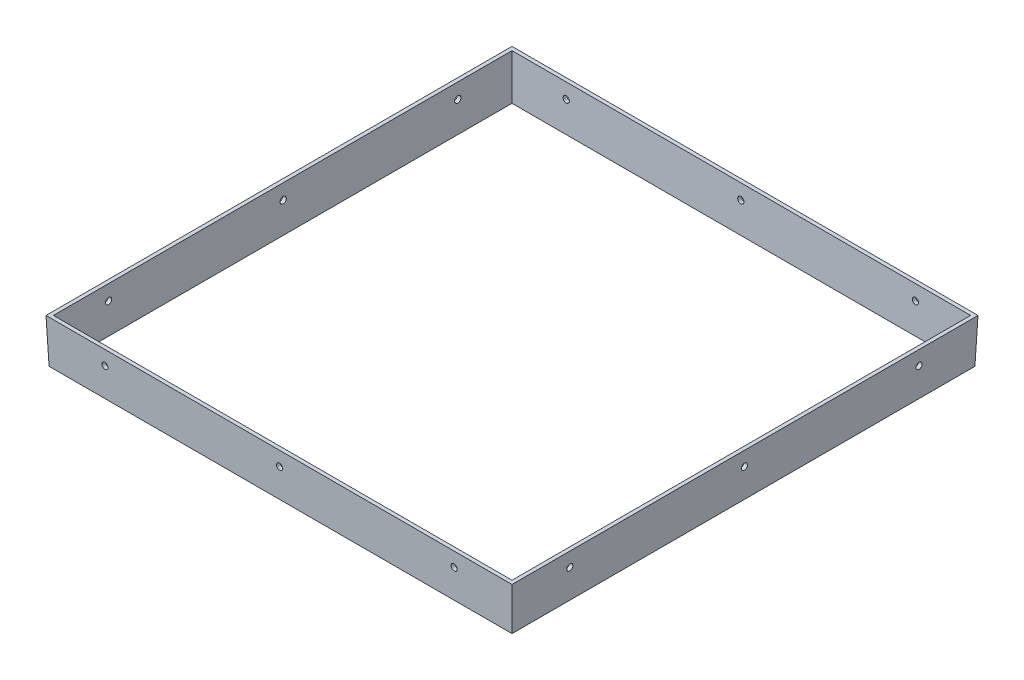
ISO-10303-21;
HEADER;
FILE_DESCRIPTION(('STEP AP214'),'2;1');
FILE_NAME('part.step','',(''),(''),'','','');
FILE_SCHEMA(('AUTOMOTIVE_DESIGN { 1 0 10303 214 1 1 1 1 }'));
ENDSEC;
DATA;
#1=APPLICATION_CONTEXT('core data for automotive mechanical design processes');
#2=APPLICATION_PROTOCOL_DEFINITION('international standard','automotive_design',2000,#1);
#3=PRODUCT_CONTEXT('',#1,'mechanical');
#4=PRODUCT('Part','Part','',(#3));
#5=PRODUCT_RELATED_PRODUCT_CATEGORY('part','',(#4));
#6=PRODUCT_DEFINITION_FORMATION('','',#4);
#7=PRODUCT_DEFINITION_CONTEXT('part definition',#1,'design');
#8=PRODUCT_DEFINITION('design','',#6,#7);
#9=PRODUCT_DEFINITION_SHAPE('','',#8);
#10=(LENGTH_UNIT() NAMED_UNIT(*) SI_UNIT(.MILLI.,.METRE.));
#11=(NAMED_UNIT(*) PLANE_ANGLE_UNIT() SI_UNIT($,.RADIAN.));
#12=(NAMED_UNIT(*) SI_UNIT($,.STERADIAN.) SOLID_ANGLE_UNIT());
#13=UNCERTAINTY_MEASURE_WITH_UNIT(LENGTH_MEASURE(1.E-05),#10,'distance_accuracy_value','');
#14=(GEOMETRIC_REPRESENTATION_CONTEXT(3) GLOBAL_UNCERTAINTY_ASSIGNED_CONTEXT((#13)) GLOBAL_UNIT_ASSIGNED_CONTEXT((#10,
#11,#12)) REPRESENTATION_CONTEXT('',''));
#15=CARTESIAN_POINT('',(0.,0.,0.));
#16=DIRECTION('',(0.,0.,1.));
#17=DIRECTION('',(1.,0.,0.));
#18=AXIS2_PLACEMENT_3D('',#15,#16,#17);
#19=CARTESIAN_POINT('',(0.,24.,0.));
#20=DIRECTION('',(0.,-1.,0.));
#21=DIRECTION('',(0.,0.,-1.));
#22=AXIS2_PLACEMENT_3D('',#19,#20,#21);
#23=PLANE('',#22);
#24=DIRECTION('',(0.,0.,1.));
#25=VECTOR('',#24,1.);
#26=CARTESIAN_POINT('',(126.768098467802,24.,0.));
#27=LINE('',#26,#25);
#28=CARTESIAN_POINT('',(126.768098467802,24.,126.768098467802));
#29=VERTEX_POINT('',#28);
#30=CARTESIAN_POINT('',(126.768098467802,24.,-126.768098467802));
#31=VERTEX_POINT('',#30);
#32=EDGE_CURVE('E168',#29,#31,#27,.F.);
#33=ORIENTED_EDGE('',*,*,#32,.T.);
#34=DIRECTION('',(1.,0.,0.));
#35=VECTOR('',#34,1.);
#36=CARTESIAN_POINT('',(0.,24.,-126.768098467802));
#37=LINE('',#36,#35);
#38=CARTESIAN_POINT('',(-126.768098467802,24.,-126.768098467802));
#39=VERTEX_POINT('',#38);
#40=EDGE_CURVE('E185',#31,#39,#37,.F.);
#41=ORIENTED_EDGE('',*,*,#40,.T.);
#42=DIRECTION('',(0.,0.,-1.));
#43=VECTOR('',#42,1.);
#44=CARTESIAN_POINT('',(-126.768098467802,24.,0.));
#45=LINE('',#44,#43);
#46=CARTESIAN_POINT('',(-126.768098467802,24.,126.768098467802));
#47=VERTEX_POINT('',#46);
#48=EDGE_CURVE('E188',#39,#47,#45,.F.);
#49=ORIENTED_EDGE('',*,*,#48,.T.);
#50=DIRECTION('',(-1.,0.,0.));
#51=VECTOR('',#50,1.);
#52=CARTESIAN_POINT('',(0.,24.,126.768098467802));
#53=LINE('',#52,#51);
#54=EDGE_CURVE('E175',#47,#29,#53,.F.);
#55=ORIENTED_EDGE('',*,*,#54,.T.);
#56=EDGE_LOOP('',(#33,#41,#49,#55));
#57=FACE_BOUND('',#56,.T.);
#58=DIRECTION('',(0.,0.,1.));
#59=VECTOR('',#58,1.);
#60=CARTESIAN_POINT('',(124.766879379204,24.,0.));
#61=LINE('',#60,#59);
#62=CARTESIAN_POINT('',(124.766879379204,24.,124.766879379204));
#63=VERTEX_POINT('',#62);
#64=CARTESIAN_POINT('',(124.766879379204,24.,-124.766879379204));
#65=VERTEX_POINT('',#64);
#66=EDGE_CURVE('E138',#63,#65,#61,.F.);
#67=ORIENTED_EDGE('',*,*,#66,.F.);
#68=DIRECTION('',(-1.,0.,0.));
#69=VECTOR('',#68,1.);
#70=CARTESIAN_POINT('',(0.,24.,124.766879379204));
#71=LINE('',#70,#69);
#72=CARTESIAN_POINT('',(-124.766879379204,24.,124.766879379204));
#73=VERTEX_POINT('',#72);
#74=EDGE_CURVE('E119',#73,#63,#71,.F.);
#75=ORIENTED_EDGE('',*,*,#74,.F.);
#76=DIRECTION('',(0.,0.,-1.));
#77=VECTOR('',#76,1.);
#78=CARTESIAN_POINT('',(-124.766879379204,24.,0.));
#79=LINE('',#78,#77);
#80=CARTESIAN_POINT('',(-124.766879379204,24.,-124.766879379204));
#81=VERTEX_POINT('',#80);
#82=EDGE_CURVE('E151',#81,#73,#79,.F.);
#83=ORIENTED_EDGE('',*,*,#82,.F.);
#84=DIRECTION('',(1.,0.,0.));
#85=VECTOR('',#84,1.);
#86=CARTESIAN_POINT('',(0.,24.,-124.766879379204));
#87=LINE('',#86,#85);
#88=EDGE_CURVE('E142',#65,#81,#87,.F.);
#89=ORIENTED_EDGE('',*,*,#88,.F.);
#90=EDGE_LOOP('',(#67,#75,#83,#89));
#91=FACE_BOUND('',#90,.T.);
#92=ADVANCED_FACE('F46',(#57,#91),#23,.F.);
#93=CARTESIAN_POINT('',(0.,0.,0.));
#94=DIRECTION('',(0.,-1.,0.));
#95=DIRECTION('',(0.,0.,-1.));
#96=AXIS2_PLACEMENT_3D('',#93,#94,#95);
#97=PLANE('',#96);
#98=DIRECTION('',(0.,0.,-1.));
#99=VECTOR('',#98,1.);
#100=CARTESIAN_POINT('',(125.93,0.,125.93));
#101=LINE('',#100,#99);
#102=CARTESIAN_POINT('',(125.93,0.,125.93));
#103=VERTEX_POINT('',#102);
#104=CARTESIAN_POINT('',(125.93,0.,-125.93));
#105=VERTEX_POINT('',#104);
#106=EDGE_CURVE('E156',#103,#105,#101,.T.);
#107=ORIENTED_EDGE('',*,*,#106,.F.);
#108=DIRECTION('',(1.,0.,0.));
#109=VECTOR('',#108,1.);
#110=CARTESIAN_POINT('',(-125.93,0.,125.93));
#111=LINE('',#110,#109);
#112=CARTESIAN_POINT('',(-125.93,0.,125.93));
#113=VERTEX_POINT('',#112);
#114=EDGE_CURVE('E166',#113,#103,#111,.T.);
#115=ORIENTED_EDGE('',*,*,#114,.F.);
#116=DIRECTION('',(0.,0.,1.));
#117=VECTOR('',#116,1.);
#118=CARTESIAN_POINT('',(-125.93,0.,125.93));
#119=LINE('',#118,#117);
#120=CARTESIAN_POINT('',(-125.93,0.,-125.93));
#121=VERTEX_POINT('',#120);
#122=EDGE_CURVE('E163',#121,#113,#119,.T.);
#123=ORIENTED_EDGE('',*,*,#122,.F.);
#124=DIRECTION('',(-1.,0.,0.));
#125=VECTOR('',#124,1.);
#126=CARTESIAN_POINT('',(-125.93,0.,-125.93));
#127=LINE('',#126,#125);
#128=EDGE_CURVE('E160',#105,#121,#127,.T.);
#129=ORIENTED_EDGE('',*,*,#128,.F.);
#130=EDGE_LOOP('',(#107,#115,#123,#129));
#131=FACE_BOUND('',#130,.T.);
#132=DIRECTION('',(-1.,0.,0.));
#133=VECTOR('',#132,1.);
#134=CARTESIAN_POINT('',(0.,0.,123.928780911402));
#135=LINE('',#134,#133);
#136=CARTESIAN_POINT('',(-123.928780911402,0.,123.928780911402));
#137=VERTEX_POINT('',#136);
#138=CARTESIAN_POINT('',(123.928780911402,0.,123.928780911402));
#139=VERTEX_POINT('',#138);
#140=EDGE_CURVE('E117',#137,#139,#135,.F.);
#141=ORIENTED_EDGE('',*,*,#140,.T.);
#142=DIRECTION('',(0.,0.,1.));
#143=VECTOR('',#142,1.);
#144=CARTESIAN_POINT('',(123.928780911402,0.,0.));
#145=LINE('',#144,#143);
#146=CARTESIAN_POINT('',(123.928780911402,0.,-123.928780911402));
#147=VERTEX_POINT('',#146);
#148=EDGE_CURVE('E126',#139,#147,#145,.F.);
#149=ORIENTED_EDGE('',*,*,#148,.T.);
#150=DIRECTION('',(1.,0.,0.));
#151=VECTOR('',#150,1.);
#152=CARTESIAN_POINT('',(0.,0.,-123.928780911402));
#153=LINE('',#152,#151);
#154=CARTESIAN_POINT('',(-123.928780911402,0.,-123.928780911402));
#155=VERTEX_POINT('',#154);
#156=EDGE_CURVE('E133',#147,#155,#153,.F.);
#157=ORIENTED_EDGE('',*,*,#156,.T.);
#158=DIRECTION('',(0.,0.,-1.));
#159=VECTOR('',#158,1.);
#160=CARTESIAN_POINT('',(-123.928780911402,0.,0.));
#161=LINE('',#160,#159);
#162=EDGE_CURVE('E71',#155,#137,#161,.F.);
#163=ORIENTED_EDGE('',*,*,#162,.T.);
#164=EDGE_LOOP('',(#141,#149,#157,#163));
#165=FACE_BOUND('',#164,.T.);
#166=ADVANCED_FACE('F136',(#131,#165),#97,.T.);
#167=CARTESIAN_POINT('',(125.93,0.,125.93));
#168=DIRECTION('',(0.999390827019096,-0.034899496702501,0.));
#169=DIRECTION('',(0.034899496702501,0.999390827019096,0.));
#170=AXIS2_PLACEMENT_3D('',#167,#168,#169);
#171=PLANE('',#170);
#172=CARTESIAN_POINT('',(126.488902494182,16.0048733838472,-95.));
#173=DIRECTION('',(0.999390827019096,-0.034899496702501,0.));
#174=DIRECTION('',(0.034899496702501,0.999390827019096,0.));
#175=AXIS2_PLACEMENT_3D('',#172,#173,#174);
#176=CIRCLE('',#175,1.7);
#177=CARTESIAN_POINT('',(126.548231638576,17.7038377897797,-95.));
#178=VERTEX_POINT('',#177);
#179=EDGE_CURVE('E198',#178,#178,#176,.F.);
#180=ORIENTED_EDGE('',*,*,#179,.T.);
#181=EDGE_LOOP('',(#180));
#182=FACE_BOUND('',#181,.T.);
#183=CARTESIAN_POINT('',(126.488902494182,16.0048733838472,0.));
#184=DIRECTION('',(0.999390827019096,-0.034899496702501,0.));
#185=DIRECTION('',(0.034899496702501,0.999390827019096,0.));
#186=AXIS2_PLACEMENT_3D('',#183,#184,#185);
#187=CIRCLE('',#186,1.7);
#188=CARTESIAN_POINT('',(126.548231638576,17.7038377897797,0.));
#189=VERTEX_POINT('',#188);
#190=EDGE_CURVE('E218',#189,#189,#187,.F.);
#191=ORIENTED_EDGE('',*,*,#190,.T.);
#192=EDGE_LOOP('',(#191));
#193=FACE_BOUND('',#192,.T.);
#194=CARTESIAN_POINT('',(126.488902494182,16.0048733838472,95.));
#195=DIRECTION('',(0.999390827019096,-0.034899496702501,0.));
#196=DIRECTION('',(0.034899496702501,0.999390827019096,0.));
#197=AXIS2_PLACEMENT_3D('',#194,#195,#196);
#198=CIRCLE('',#197,1.70000000000001);
#199=CARTESIAN_POINT('',(126.548231638576,17.7038377897797,95.));
#200=VERTEX_POINT('',#199);
#201=EDGE_CURVE('E212',#200,#200,#198,.F.);
#202=ORIENTED_EDGE('',*,*,#201,.T.);
#203=EDGE_LOOP('',(#202));
#204=FACE_BOUND('',#203,.T.);
#205=ORIENTED_EDGE('',*,*,#106,.T.);
#206=DIRECTION('',(-0.0348782627423747,-0.998782765958718,0.0348782627423747));
#207=VECTOR('',#206,1.);
#208=CARTESIAN_POINT('',(125.623614019644,-8.7737465358006,-125.623614019644));
#209=LINE('',#208,#207);
#210=EDGE_CURVE('E11',#31,#105,#209,.T.);
#211=ORIENTED_EDGE('',*,*,#210,.F.);
#212=ORIENTED_EDGE('',*,*,#32,.F.);
#213=DIRECTION('',(-0.0348782627423747,-0.998782765958718,-0.0348782627423747));
#214=VECTOR('',#213,1.);
#215=CARTESIAN_POINT('',(125.93,0.,125.93));
#216=LINE('',#215,#214);
#217=EDGE_CURVE('E170',#29,#103,#216,.T.);
#218=ORIENTED_EDGE('',*,*,#217,.T.);
#219=EDGE_LOOP('',(#205,#211,#212,#218));
#220=FACE_BOUND('',#219,.T.);
#221=ADVANCED_FACE('F311',(#182,#193,#204,#220),#171,.T.);
#222=CARTESIAN_POINT('',(-125.93,0.,-125.93));
#223=DIRECTION('',(0.,-0.034899496702501,-0.999390827019096));
#224=DIRECTION('',(0.,0.999390827019096,-0.034899496702501));
#225=AXIS2_PLACEMENT_3D('',#222,#223,#224);
#226=PLANE('',#225);
#227=CARTESIAN_POINT('',(95.,16.0048733838472,-126.488902494182));
#228=DIRECTION('',(0.,-0.0348994967025011,-0.999390827019096));
#229=DIRECTION('',(0.,0.999390827019096,-0.0348994967025011));
#230=AXIS2_PLACEMENT_3D('',#227,#228,#229);
#231=CIRCLE('',#230,1.70000000000001);
#232=CARTESIAN_POINT('',(95.,17.7038377897797,-126.548231638576));
#233=VERTEX_POINT('',#232);
#234=EDGE_CURVE('E228',#233,#233,#231,.T.);
#235=ORIENTED_EDGE('',*,*,#234,.F.);
#236=EDGE_LOOP('',(#235));
#237=FACE_BOUND('',#236,.T.);
#238=CARTESIAN_POINT('',(0.,16.0048733838472,-126.488902494182));
#239=DIRECTION('',(0.,-0.0348994967025011,-0.999390827019096));
#240=DIRECTION('',(0.,0.999390827019096,-0.0348994967025011));
#241=AXIS2_PLACEMENT_3D('',#238,#239,#240);
#242=CIRCLE('',#241,1.7);
#243=CARTESIAN_POINT('',(0.,17.7038377897797,-126.548231638576));
#244=VERTEX_POINT('',#243);
#245=EDGE_CURVE('E251',#244,#244,#242,.T.);
#246=ORIENTED_EDGE('',*,*,#245,.F.);
#247=EDGE_LOOP('',(#246));
#248=FACE_BOUND('',#247,.T.);
#249=CARTESIAN_POINT('',(-95.,16.0048733838472,-126.488902494182));
#250=DIRECTION('',(0.,-0.0348994967025011,-0.999390827019096));
#251=DIRECTION('',(0.,0.999390827019096,-0.0348994967025011));
#252=AXIS2_PLACEMENT_3D('',#249,#250,#251);
#253=CIRCLE('',#252,1.70000000000001);
#254=CARTESIAN_POINT('',(-95.,17.7038377897797,-126.548231638576));
#255=VERTEX_POINT('',#254);
#256=EDGE_CURVE('E246',#255,#255,#253,.T.);
#257=ORIENTED_EDGE('',*,*,#256,.F.);
#258=EDGE_LOOP('',(#257));
#259=FACE_BOUND('',#258,.T.);
#260=ORIENTED_EDGE('',*,*,#128,.T.);
#261=DIRECTION('',(0.0348782627423747,-0.998782765958718,0.0348782627423747));
#262=VECTOR('',#261,1.);
#263=CARTESIAN_POINT('',(-125.623614019644,-8.7737465358006,-125.623614019644));
#264=LINE('',#263,#262);
#265=EDGE_CURVE('E56',#39,#121,#264,.T.);
#266=ORIENTED_EDGE('',*,*,#265,.F.);
#267=ORIENTED_EDGE('',*,*,#40,.F.);
#268=ORIENTED_EDGE('',*,*,#210,.T.);
#269=EDGE_LOOP('',(#260,#266,#267,#268));
#270=FACE_BOUND('',#269,.T.);
#271=ADVANCED_FACE('F48',(#237,#248,#259,#270),#226,.T.);
#272=CARTESIAN_POINT('',(-125.93,0.,125.93));
#273=DIRECTION('',(-0.999390827019096,-0.034899496702501,0.));
#274=DIRECTION('',(0.034899496702501,-0.999390827019096,0.));
#275=AXIS2_PLACEMENT_3D('',#272,#273,#274);
#276=PLANE('',#275);
#277=CARTESIAN_POINT('',(-126.488902494182,16.0048733838472,-95.));
#278=DIRECTION('',(-0.999390827019096,-0.034899496702501,0.));
#279=DIRECTION('',(0.034899496702501,-0.999390827019096,0.));
#280=AXIS2_PLACEMENT_3D('',#277,#278,#279);
#281=CIRCLE('',#280,1.7);
#282=CARTESIAN_POINT('',(-126.429573349788,14.3059089779148,-95.));
#283=VERTEX_POINT('',#282);
#284=EDGE_CURVE('E134',#283,#283,#281,.T.);
#285=ORIENTED_EDGE('',*,*,#284,.F.);
#286=EDGE_LOOP('',(#285));
#287=FACE_BOUND('',#286,.T.);
#288=CARTESIAN_POINT('',(-126.488902494182,16.0048733838472,0.));
#289=DIRECTION('',(-0.999390827019096,-0.034899496702501,0.));
#290=DIRECTION('',(0.034899496702501,-0.999390827019096,0.));
#291=AXIS2_PLACEMENT_3D('',#288,#289,#290);
#292=CIRCLE('',#291,1.7);
#293=CARTESIAN_POINT('',(-126.429573349788,14.3059089779148,0.));
#294=VERTEX_POINT('',#293);
#295=EDGE_CURVE('E203',#294,#294,#292,.T.);
#296=ORIENTED_EDGE('',*,*,#295,.F.);
#297=EDGE_LOOP('',(#296));
#298=FACE_BOUND('',#297,.T.);
#299=CARTESIAN_POINT('',(-126.488902494182,16.0048733838472,95.));
#300=DIRECTION('',(-0.999390827019096,-0.034899496702501,0.));
#301=DIRECTION('',(0.034899496702501,-0.999390827019096,0.));
#302=AXIS2_PLACEMENT_3D('',#299,#300,#301);
#303=CIRCLE('',#302,1.70000000000001);
#304=CARTESIAN_POINT('',(-126.429573349788,14.3059089779148,95.));
#305=VERTEX_POINT('',#304);
#306=EDGE_CURVE('E197',#305,#305,#303,.T.);
#307=ORIENTED_EDGE('',*,*,#306,.F.);
#308=EDGE_LOOP('',(#307));
#309=FACE_BOUND('',#308,.T.);
#310=ORIENTED_EDGE('',*,*,#122,.T.);
#311=DIRECTION('',(0.0348782627423747,-0.998782765958718,-0.0348782627423747));
#312=VECTOR('',#311,1.);
#313=CARTESIAN_POINT('',(-125.93,0.,125.93));
#314=LINE('',#313,#312);
#315=EDGE_CURVE('E174',#47,#113,#314,.T.);
#316=ORIENTED_EDGE('',*,*,#315,.F.);
#317=ORIENTED_EDGE('',*,*,#48,.F.);
#318=ORIENTED_EDGE('',*,*,#265,.T.);
#319=EDGE_LOOP('',(#310,#316,#317,#318));
#320=FACE_BOUND('',#319,.T.);
#321=ADVANCED_FACE('F320',(#287,#298,#309,#320),#276,.T.);
#322=CARTESIAN_POINT('',(-125.93,0.,125.93));
#323=DIRECTION('',(0.,-0.034899496702501,0.999390827019096));
#324=DIRECTION('',(0.,-0.999390827019096,-0.034899496702501));
#325=AXIS2_PLACEMENT_3D('',#322,#323,#324);
#326=PLANE('',#325);
#327=CARTESIAN_POINT('',(95.,16.0048733838472,126.488902494182));
#328=DIRECTION('',(0.,0.0348994967025011,-0.999390827019096));
#329=DIRECTION('',(0.,0.999390827019096,0.0348994967025011));
#330=AXIS2_PLACEMENT_3D('',#327,#328,#329);
#331=CIRCLE('',#330,1.70000000000001);
#332=CARTESIAN_POINT('',(95.,17.7038377897797,126.548231638576));
#333=VERTEX_POINT('',#332);
#334=EDGE_CURVE('E239',#333,#333,#331,.T.);
#335=ORIENTED_EDGE('',*,*,#334,.T.);
#336=EDGE_LOOP('',(#335));
#337=FACE_BOUND('',#336,.T.);
#338=CARTESIAN_POINT('',(0.,16.0048733838472,126.488902494182));
#339=DIRECTION('',(0.,0.0348994967025011,-0.999390827019096));
#340=DIRECTION('',(0.,0.999390827019096,0.0348994967025011));
#341=AXIS2_PLACEMENT_3D('',#338,#339,#340);
#342=CIRCLE('',#341,1.7);
#343=CARTESIAN_POINT('',(0.,17.7038377897797,126.548231638576));
#344=VERTEX_POINT('',#343);
#345=EDGE_CURVE('E404',#344,#344,#342,.T.);
#346=ORIENTED_EDGE('',*,*,#345,.T.);
#347=EDGE_LOOP('',(#346));
#348=FACE_BOUND('',#347,.T.);
#349=CARTESIAN_POINT('',(-95.,16.0048733838472,126.488902494182));
#350=DIRECTION('',(0.,0.0348994967025011,-0.999390827019096));
#351=DIRECTION('',(0.,0.999390827019096,0.0348994967025011));
#352=AXIS2_PLACEMENT_3D('',#349,#350,#351);
#353=CIRCLE('',#352,1.70000000000001);
#354=CARTESIAN_POINT('',(-95.,17.7038377897797,126.548231638576));
#355=VERTEX_POINT('',#354);
#356=EDGE_CURVE('E408',#355,#355,#353,.T.);
#357=ORIENTED_EDGE('',*,*,#356,.T.);
#358=EDGE_LOOP('',(#357));
#359=FACE_BOUND('',#358,.T.);
#360=ORIENTED_EDGE('',*,*,#114,.T.);
#361=ORIENTED_EDGE('',*,*,#217,.F.);
#362=ORIENTED_EDGE('',*,*,#54,.F.);
#363=ORIENTED_EDGE('',*,*,#315,.T.);
#364=EDGE_LOOP('',(#360,#361,#362,#363));
#365=FACE_BOUND('',#364,.T.);
#366=ADVANCED_FACE('F300',(#337,#348,#359,#365),#326,.T.);
#367=CARTESIAN_POINT('',(123.931218345962,0.0697989934050021,125.93));
#368=DIRECTION('',(0.999390827019096,-0.034899496702501,0.));
#369=DIRECTION('',(0.034899496702501,0.999390827019096,0.));
#370=AXIS2_PLACEMENT_3D('',#367,#368,#369);
#371=PLANE('',#370);
#372=CARTESIAN_POINT('',(124.490120840144,16.0746723772522,-95.));
#373=DIRECTION('',(0.999390827019096,-0.034899496702501,0.));
#374=DIRECTION('',(0.034899496702501,0.999390827019096,0.));
#375=AXIS2_PLACEMENT_3D('',#372,#373,#374);
#376=CIRCLE('',#375,1.7);
#377=CARTESIAN_POINT('',(124.549449984538,17.7736367831847,-95.));
#378=VERTEX_POINT('',#377);
#379=EDGE_CURVE('E219',#378,#378,#376,.F.);
#380=ORIENTED_EDGE('',*,*,#379,.F.);
#381=EDGE_LOOP('',(#380));
#382=FACE_BOUND('',#381,.T.);
#383=CARTESIAN_POINT('',(124.490120840144,16.0746723772522,0.));
#384=DIRECTION('',(0.999390827019096,-0.034899496702501,0.));
#385=DIRECTION('',(0.034899496702501,0.999390827019096,0.));
#386=AXIS2_PLACEMENT_3D('',#383,#384,#385);
#387=CIRCLE('',#386,1.7);
#388=CARTESIAN_POINT('',(124.549449984538,17.7736367831847,0.));
#389=VERTEX_POINT('',#388);
#390=EDGE_CURVE('E214',#389,#389,#387,.F.);
#391=ORIENTED_EDGE('',*,*,#390,.F.);
#392=EDGE_LOOP('',(#391));
#393=FACE_BOUND('',#392,.T.);
#394=CARTESIAN_POINT('',(124.490120840144,16.0746723772522,95.));
#395=DIRECTION('',(0.999390827019096,-0.034899496702501,0.));
#396=DIRECTION('',(0.034899496702501,0.999390827019096,0.));
#397=AXIS2_PLACEMENT_3D('',#394,#395,#396);
#398=CIRCLE('',#397,1.70000000000001);
#399=CARTESIAN_POINT('',(124.549449984538,17.7736367831847,95.));
#400=VERTEX_POINT('',#399);
#401=EDGE_CURVE('E208',#400,#400,#398,.F.);
#402=ORIENTED_EDGE('',*,*,#401,.F.);
#403=EDGE_LOOP('',(#402));
#404=FACE_BOUND('',#403,.T.);
#405=ORIENTED_EDGE('',*,*,#148,.F.);
#406=DIRECTION('',(-0.0348782627423747,-0.998782765958718,-0.0348782627423747));
#407=VECTOR('',#406,1.);
#408=CARTESIAN_POINT('',(123.933649850276,0.139428166806651,123.933649850276));
#409=LINE('',#408,#407);
#410=EDGE_CURVE('E113',#63,#139,#409,.T.);
#411=ORIENTED_EDGE('',*,*,#410,.F.);
#412=ORIENTED_EDGE('',*,*,#66,.T.);
#413=DIRECTION('',(-0.0348782627423747,-0.998782765958718,0.0348782627423747));
#414=VECTOR('',#413,1.);
#415=CARTESIAN_POINT('',(123.62726386992,-8.63431836899394,-123.62726386992));
#416=LINE('',#415,#414);
#417=EDGE_CURVE('E129',#65,#147,#416,.T.);
#418=ORIENTED_EDGE('',*,*,#417,.T.);
#419=EDGE_LOOP('',(#405,#411,#412,#418));
#420=FACE_BOUND('',#419,.T.);
#421=ADVANCED_FACE('F127',(#382,#393,#404,#420),#371,.F.);
#422=CARTESIAN_POINT('',(-125.93,0.0697989934050021,-123.931218345962));
#423=DIRECTION('',(0.,-0.034899496702501,-0.999390827019096));
#424=DIRECTION('',(0.,0.999390827019096,-0.034899496702501));
#425=AXIS2_PLACEMENT_3D('',#422,#423,#424);
#426=PLANE('',#425);
#427=CARTESIAN_POINT('',(95.,16.0746723772522,-124.490120840144));
#428=DIRECTION('',(0.,-0.034899496702501,-0.999390827019096));
#429=DIRECTION('',(0.,0.999390827019096,-0.034899496702501));
#430=AXIS2_PLACEMENT_3D('',#427,#428,#429);
#431=CIRCLE('',#430,1.70000000000001);
#432=CARTESIAN_POINT('',(95.,17.7736367831847,-124.549449984538));
#433=VERTEX_POINT('',#432);
#434=EDGE_CURVE('E213',#433,#433,#431,.F.);
#435=ORIENTED_EDGE('',*,*,#434,.F.);
#436=EDGE_LOOP('',(#435));
#437=FACE_BOUND('',#436,.T.);
#438=CARTESIAN_POINT('',(0.,16.0746723772522,-124.490120840144));
#439=DIRECTION('',(0.,-0.034899496702501,-0.999390827019096));
#440=DIRECTION('',(0.,0.999390827019096,-0.034899496702501));
#441=AXIS2_PLACEMENT_3D('',#438,#439,#440);
#442=CIRCLE('',#441,1.7);
#443=CARTESIAN_POINT('',(0.,17.7736367831847,-124.549449984538));
#444=VERTEX_POINT('',#443);
#445=EDGE_CURVE('E227',#444,#444,#442,.F.);
#446=ORIENTED_EDGE('',*,*,#445,.F.);
#447=EDGE_LOOP('',(#446));
#448=FACE_BOUND('',#447,.T.);
#449=CARTESIAN_POINT('',(-95.,16.0746723772522,-124.490120840144));
#450=DIRECTION('',(0.,-0.034899496702501,-0.999390827019096));
#451=DIRECTION('',(0.,0.999390827019096,-0.034899496702501));
#452=AXIS2_PLACEMENT_3D('',#449,#450,#451);
#453=CIRCLE('',#452,1.70000000000001);
#454=CARTESIAN_POINT('',(-95.,17.7736367831847,-124.549449984538));
#455=VERTEX_POINT('',#454);
#456=EDGE_CURVE('E223',#455,#455,#453,.F.);
#457=ORIENTED_EDGE('',*,*,#456,.F.);
#458=EDGE_LOOP('',(#457));
#459=FACE_BOUND('',#458,.T.);
#460=ORIENTED_EDGE('',*,*,#156,.F.);
#461=ORIENTED_EDGE('',*,*,#417,.F.);
#462=ORIENTED_EDGE('',*,*,#88,.T.);
#463=DIRECTION('',(0.0348782627423747,-0.998782765958718,0.0348782627423747));
#464=VECTOR('',#463,1.);
#465=CARTESIAN_POINT('',(-123.62726386992,-8.63431836899394,-123.62726386992));
#466=LINE('',#465,#464);
#467=EDGE_CURVE('E279',#81,#155,#466,.T.);
#468=ORIENTED_EDGE('',*,*,#467,.T.);
#469=EDGE_LOOP('',(#460,#461,#462,#468));
#470=FACE_BOUND('',#469,.T.);
#471=ADVANCED_FACE('F288',(#437,#448,#459,#470),#426,.F.);
#472=CARTESIAN_POINT('',(-123.931218345962,0.0697989934050021,125.93));
#473=DIRECTION('',(-0.999390827019096,-0.034899496702501,0.));
#474=DIRECTION('',(0.034899496702501,-0.999390827019096,0.));
#475=AXIS2_PLACEMENT_3D('',#472,#473,#474);
#476=PLANE('',#475);
#477=CARTESIAN_POINT('',(-124.490120840144,16.0746723772522,-95.));
#478=DIRECTION('',(-0.999390827019096,-0.034899496702501,0.));
#479=DIRECTION('',(0.034899496702501,-0.999390827019096,0.));
#480=AXIS2_PLACEMENT_3D('',#477,#478,#479);
#481=CIRCLE('',#480,1.7);
#482=CARTESIAN_POINT('',(-124.43079169575,14.3757079713198,-95.));
#483=VERTEX_POINT('',#482);
#484=EDGE_CURVE('E204',#483,#483,#481,.T.);
#485=ORIENTED_EDGE('',*,*,#484,.T.);
#486=EDGE_LOOP('',(#485));
#487=FACE_BOUND('',#486,.T.);
#488=CARTESIAN_POINT('',(-124.490120840144,16.0746723772522,0.));
#489=DIRECTION('',(-0.999390827019096,-0.034899496702501,0.));
#490=DIRECTION('',(0.034899496702501,-0.999390827019096,0.));
#491=AXIS2_PLACEMENT_3D('',#488,#489,#490);
#492=CIRCLE('',#491,1.7);
#493=CARTESIAN_POINT('',(-124.43079169575,14.3757079713198,0.));
#494=VERTEX_POINT('',#493);
#495=EDGE_CURVE('E199',#494,#494,#492,.T.);
#496=ORIENTED_EDGE('',*,*,#495,.T.);
#497=EDGE_LOOP('',(#496));
#498=FACE_BOUND('',#497,.T.);
#499=CARTESIAN_POINT('',(-124.490120840144,16.0746723772522,95.));
#500=DIRECTION('',(-0.999390827019096,-0.034899496702501,0.));
#501=DIRECTION('',(0.034899496702501,-0.999390827019096,0.));
#502=AXIS2_PLACEMENT_3D('',#499,#500,#501);
#503=CIRCLE('',#502,1.70000000000001);
#504=CARTESIAN_POINT('',(-124.43079169575,14.3757079713198,95.));
#505=VERTEX_POINT('',#504);
#506=EDGE_CURVE('E193',#505,#505,#503,.T.);
#507=ORIENTED_EDGE('',*,*,#506,.T.);
#508=EDGE_LOOP('',(#507));
#509=FACE_BOUND('',#508,.T.);
#510=ORIENTED_EDGE('',*,*,#162,.F.);
#511=ORIENTED_EDGE('',*,*,#467,.F.);
#512=ORIENTED_EDGE('',*,*,#82,.T.);
#513=DIRECTION('',(0.0348782627423747,-0.998782765958718,-0.0348782627423747));
#514=VECTOR('',#513,1.);
#515=CARTESIAN_POINT('',(-123.933649850276,0.139428166806651,123.933649850276));
#516=LINE('',#515,#514);
#517=EDGE_CURVE('E64',#73,#137,#516,.T.);
#518=ORIENTED_EDGE('',*,*,#517,.T.);
#519=EDGE_LOOP('',(#510,#511,#512,#518));
#520=FACE_BOUND('',#519,.T.);
#521=ADVANCED_FACE('F283',(#487,#498,#509,#520),#476,.F.);
#522=CARTESIAN_POINT('',(-125.93,0.0697989934050021,123.931218345962));
#523=DIRECTION('',(0.,-0.034899496702501,0.999390827019096));
#524=DIRECTION('',(0.,-0.999390827019096,-0.034899496702501));
#525=AXIS2_PLACEMENT_3D('',#522,#523,#524);
#526=PLANE('',#525);
#527=CARTESIAN_POINT('',(95.,16.0746723772522,124.490120840144));
#528=DIRECTION('',(0.,-0.034899496702501,0.999390827019096));
#529=DIRECTION('',(0.,-0.999390827019096,-0.034899496702501));
#530=AXIS2_PLACEMENT_3D('',#527,#528,#529);
#531=CIRCLE('',#530,1.70000000000001);
#532=CARTESIAN_POINT('',(95.,14.3757079713198,124.43079169575));
#533=VERTEX_POINT('',#532);
#534=EDGE_CURVE('E50',#533,#533,#531,.T.);
#535=ORIENTED_EDGE('',*,*,#534,.T.);
#536=EDGE_LOOP('',(#535));
#537=FACE_BOUND('',#536,.T.);
#538=CARTESIAN_POINT('',(0.,16.0746723772522,124.490120840144));
#539=DIRECTION('',(0.,-0.034899496702501,0.999390827019096));
#540=DIRECTION('',(0.,-0.999390827019096,-0.034899496702501));
#541=AXIS2_PLACEMENT_3D('',#538,#539,#540);
#542=CIRCLE('',#541,1.7);
#543=CARTESIAN_POINT('',(0.,14.3757079713198,124.43079169575));
#544=VERTEX_POINT('',#543);
#545=EDGE_CURVE('E238',#544,#544,#542,.T.);
#546=ORIENTED_EDGE('',*,*,#545,.T.);
#547=EDGE_LOOP('',(#546));
#548=FACE_BOUND('',#547,.T.);
#549=CARTESIAN_POINT('',(-95.,16.0746723772522,124.490120840144));
#550=DIRECTION('',(0.,-0.034899496702501,0.999390827019096));
#551=DIRECTION('',(0.,-0.999390827019096,-0.034899496702501));
#552=AXIS2_PLACEMENT_3D('',#549,#550,#551);
#553=CIRCLE('',#552,1.70000000000001);
#554=CARTESIAN_POINT('',(-95.,14.3757079713198,124.43079169575));
#555=VERTEX_POINT('',#554);
#556=EDGE_CURVE('E235',#555,#555,#553,.T.);
#557=ORIENTED_EDGE('',*,*,#556,.T.);
#558=EDGE_LOOP('',(#557));
#559=FACE_BOUND('',#558,.T.);
#560=ORIENTED_EDGE('',*,*,#140,.F.);
#561=ORIENTED_EDGE('',*,*,#517,.F.);
#562=ORIENTED_EDGE('',*,*,#74,.T.);
#563=ORIENTED_EDGE('',*,*,#410,.T.);
#564=EDGE_LOOP('',(#560,#561,#562,#563));
#565=FACE_BOUND('',#564,.T.);
#566=ADVANCED_FACE('F115',(#537,#548,#559,#565),#526,.F.);
#567=CARTESIAN_POINT('',(-127.325980179111,15.9756419869651,95.));
#568=DIRECTION('',(0.999390827019096,0.0348994967025011,0.));
#569=DIRECTION('',(-0.0348994967025011,0.999390827019096,0.));
#570=AXIS2_PLACEMENT_3D('',#567,#568,#569);
#571=CYLINDRICAL_SURFACE('',#570,1.70000000000001);
#572=ORIENTED_EDGE('',*,*,#506,.F.);
#573=EDGE_LOOP('',(#572));
#574=FACE_BOUND('',#573,.T.);
#575=ORIENTED_EDGE('',*,*,#306,.T.);
#576=EDGE_LOOP('',(#575));
#577=FACE_BOUND('',#576,.T.);
#578=ADVANCED_FACE('F347',(#574,#577),#571,.F.);
#579=CARTESIAN_POINT('',(-127.325980179111,15.9756419869651,0.));
#580=DIRECTION('',(0.999390827019096,0.0348994967025011,0.));
#581=DIRECTION('',(-0.0348994967025011,0.999390827019096,0.));
#582=AXIS2_PLACEMENT_3D('',#579,#580,#581);
#583=CYLINDRICAL_SURFACE('',#582,1.7);
#584=ORIENTED_EDGE('',*,*,#495,.F.);
#585=EDGE_LOOP('',(#584));
#586=FACE_BOUND('',#585,.T.);
#587=ORIENTED_EDGE('',*,*,#295,.T.);
#588=EDGE_LOOP('',(#587));
#589=FACE_BOUND('',#588,.T.);
#590=ADVANCED_FACE('F349',(#586,#589),#583,.F.);
#591=CARTESIAN_POINT('',(-127.325980179111,15.9756419869651,-95.));
#592=DIRECTION('',(0.999390827019096,0.0348994967025011,0.));
#593=DIRECTION('',(-0.0348994967025011,0.999390827019096,0.));
#594=AXIS2_PLACEMENT_3D('',#591,#592,#593);
#595=CYLINDRICAL_SURFACE('',#594,1.7);
#596=ORIENTED_EDGE('',*,*,#484,.F.);
#597=EDGE_LOOP('',(#596));
#598=FACE_BOUND('',#597,.T.);
#599=ORIENTED_EDGE('',*,*,#284,.T.);
#600=EDGE_LOOP('',(#599));
#601=FACE_BOUND('',#600,.T.);
#602=ADVANCED_FACE('F355',(#598,#601),#595,.F.);
#603=CARTESIAN_POINT('',(127.325980179111,15.9756419869651,95.));
#604=DIRECTION('',(-0.999390827019096,0.0348994967025011,0.));
#605=DIRECTION('',(-0.0348994967025011,-0.999390827019096,0.));
#606=AXIS2_PLACEMENT_3D('',#603,#604,#605);
#607=CYLINDRICAL_SURFACE('',#606,1.70000000000001);
#608=ORIENTED_EDGE('',*,*,#401,.T.);
#609=EDGE_LOOP('',(#608));
#610=FACE_BOUND('',#609,.T.);
#611=ORIENTED_EDGE('',*,*,#201,.F.);
#612=EDGE_LOOP('',(#611));
#613=FACE_BOUND('',#612,.T.);
#614=ADVANCED_FACE('F363',(#610,#613),#607,.F.);
#615=CARTESIAN_POINT('',(127.325980179111,15.9756419869651,0.));
#616=DIRECTION('',(-0.999390827019096,0.0348994967025011,0.));
#617=DIRECTION('',(-0.0348994967025011,-0.999390827019096,0.));
#618=AXIS2_PLACEMENT_3D('',#615,#616,#617);
#619=CYLINDRICAL_SURFACE('',#618,1.7);
#620=ORIENTED_EDGE('',*,*,#390,.T.);
#621=EDGE_LOOP('',(#620));
#622=FACE_BOUND('',#621,.T.);
#623=ORIENTED_EDGE('',*,*,#190,.F.);
#624=EDGE_LOOP('',(#623));
#625=FACE_BOUND('',#624,.T.);
#626=ADVANCED_FACE('F367',(#622,#625),#619,.F.);
#627=CARTESIAN_POINT('',(127.325980179111,15.9756419869651,-95.));
#628=DIRECTION('',(-0.999390827019096,0.0348994967025011,0.));
#629=DIRECTION('',(-0.0348994967025011,-0.999390827019096,0.));
#630=AXIS2_PLACEMENT_3D('',#627,#628,#629);
#631=CYLINDRICAL_SURFACE('',#630,1.7);
#632=ORIENTED_EDGE('',*,*,#379,.T.);
#633=EDGE_LOOP('',(#632));
#634=FACE_BOUND('',#633,.T.);
#635=ORIENTED_EDGE('',*,*,#179,.F.);
#636=EDGE_LOOP('',(#635));
#637=FACE_BOUND('',#636,.T.);
#638=ADVANCED_FACE('F371',(#634,#637),#631,.F.);
#639=CARTESIAN_POINT('',(-95.,16.3538683508722,-116.494994223991));
#640=DIRECTION('',(0.,-0.0348994967025011,-0.999390827019096));
#641=DIRECTION('',(0.,0.999390827019096,-0.0348994967025011));
#642=AXIS2_PLACEMENT_3D('',#639,#640,#641);
#643=CYLINDRICAL_SURFACE('',#642,1.70000000000001);
#644=ORIENTED_EDGE('',*,*,#456,.T.);
#645=EDGE_LOOP('',(#644));
#646=FACE_BOUND('',#645,.T.);
#647=ORIENTED_EDGE('',*,*,#256,.T.);
#648=EDGE_LOOP('',(#647));
#649=FACE_BOUND('',#648,.T.);
#650=ADVANCED_FACE('F375',(#646,#649),#643,.F.);
#651=CARTESIAN_POINT('',(0.,16.3538683508722,-116.494994223991));
#652=DIRECTION('',(0.,-0.0348994967025011,-0.999390827019096));
#653=DIRECTION('',(0.,0.999390827019096,-0.0348994967025011));
#654=AXIS2_PLACEMENT_3D('',#651,#652,#653);
#655=CYLINDRICAL_SURFACE('',#654,1.7);
#656=ORIENTED_EDGE('',*,*,#445,.T.);
#657=EDGE_LOOP('',(#656));
#658=FACE_BOUND('',#657,.T.);
#659=ORIENTED_EDGE('',*,*,#245,.T.);
#660=EDGE_LOOP('',(#659));
#661=FACE_BOUND('',#660,.T.);
#662=ADVANCED_FACE('F378',(#658,#661),#655,.F.);
#663=CARTESIAN_POINT('',(95.,16.3538683508722,-116.494994223991));
#664=DIRECTION('',(0.,-0.0348994967025011,-0.999390827019096));
#665=DIRECTION('',(0.,0.999390827019096,-0.0348994967025011));
#666=AXIS2_PLACEMENT_3D('',#663,#664,#665);
#667=CYLINDRICAL_SURFACE('',#666,1.70000000000001);
#668=ORIENTED_EDGE('',*,*,#434,.T.);
#669=EDGE_LOOP('',(#668));
#670=FACE_BOUND('',#669,.T.);
#671=ORIENTED_EDGE('',*,*,#234,.T.);
#672=EDGE_LOOP('',(#671));
#673=FACE_BOUND('',#672,.T.);
#674=ADVANCED_FACE('F382',(#670,#673),#667,.F.);
#675=CARTESIAN_POINT('',(-95.,16.3538683508722,116.494994223991));
#676=DIRECTION('',(0.,-0.0348994967025011,0.999390827019096));
#677=DIRECTION('',(0.,-0.999390827019096,-0.0348994967025011));
#678=AXIS2_PLACEMENT_3D('',#675,#676,#677);
#679=CYLINDRICAL_SURFACE('',#678,1.70000000000001);
#680=ORIENTED_EDGE('',*,*,#556,.F.);
#681=EDGE_LOOP('',(#680));
#682=FACE_BOUND('',#681,.T.);
#683=ORIENTED_EDGE('',*,*,#356,.F.);
#684=EDGE_LOOP('',(#683));
#685=FACE_BOUND('',#684,.T.);
#686=ADVANCED_FACE('F386',(#682,#685),#679,.F.);
#687=CARTESIAN_POINT('',(0.,16.3538683508722,116.494994223991));
#688=DIRECTION('',(0.,-0.0348994967025011,0.999390827019096));
#689=DIRECTION('',(0.,-0.999390827019096,-0.0348994967025011));
#690=AXIS2_PLACEMENT_3D('',#687,#688,#689);
#691=CYLINDRICAL_SURFACE('',#690,1.7);
#692=ORIENTED_EDGE('',*,*,#545,.F.);
#693=EDGE_LOOP('',(#692));
#694=FACE_BOUND('',#693,.T.);
#695=ORIENTED_EDGE('',*,*,#345,.F.);
#696=EDGE_LOOP('',(#695));
#697=FACE_BOUND('',#696,.T.);
#698=ADVANCED_FACE('F390',(#694,#697),#691,.F.);
#699=CARTESIAN_POINT('',(95.,16.3538683508722,116.494994223991));
#700=DIRECTION('',(0.,-0.0348994967025011,0.999390827019096));
#701=DIRECTION('',(0.,-0.999390827019096,-0.0348994967025011));
#702=AXIS2_PLACEMENT_3D('',#699,#700,#701);
#703=CYLINDRICAL_SURFACE('',#702,1.70000000000001);
#704=ORIENTED_EDGE('',*,*,#534,.F.);
#705=EDGE_LOOP('',(#704));
#706=FACE_BOUND('',#705,.T.);
#707=ORIENTED_EDGE('',*,*,#334,.F.);
#708=EDGE_LOOP('',(#707));
#709=FACE_BOUND('',#708,.T.);
#710=ADVANCED_FACE('F394',(#706,#709),#703,.F.);
#711=CLOSED_SHELL('',(#92,#166,#221,#271,#321,#366,#421,#471,#521,#566,#578,#590,#602,#614,#626,
#638,#650,#662,#674,#686,#698,#710));
#712=MANIFOLD_SOLID_BREP('B2',#711);
#713=ADVANCED_BREP_SHAPE_REPRESENTATION('',(#18,#712),#14);
#714=SHAPE_DEFINITION_REPRESENTATION(#9,#713);
ENDSEC;
END-ISO-10303-21;
